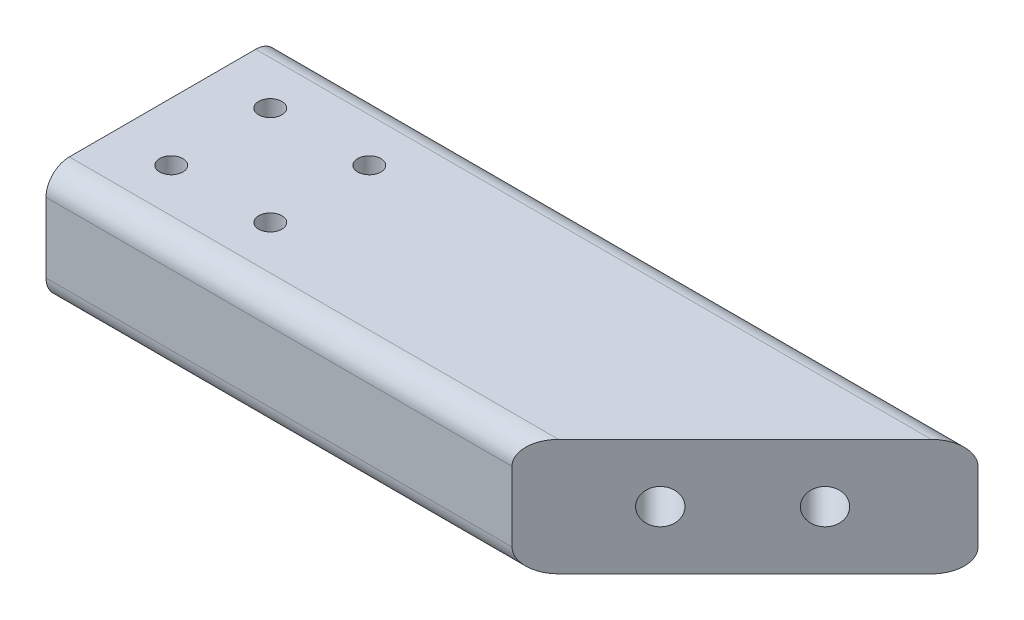
ISO-10303-21;
HEADER;
FILE_DESCRIPTION(('STEP AP214'),'2;1');
FILE_NAME('part.step','',(''),(''),'','','');
FILE_SCHEMA(('AUTOMOTIVE_DESIGN { 1 0 10303 214 1 1 1 1 }'));
ENDSEC;
DATA;
#1=APPLICATION_CONTEXT('core data for automotive mechanical design processes');
#2=APPLICATION_PROTOCOL_DEFINITION('international standard','automotive_design',2000,#1);
#3=PRODUCT_CONTEXT('',#1,'mechanical');
#4=PRODUCT('Part','Part','',(#3));
#5=PRODUCT_RELATED_PRODUCT_CATEGORY('part','',(#4));
#6=PRODUCT_DEFINITION_FORMATION('','',#4);
#7=PRODUCT_DEFINITION_CONTEXT('part definition',#1,'design');
#8=PRODUCT_DEFINITION('design','',#6,#7);
#9=PRODUCT_DEFINITION_SHAPE('','',#8);
#10=(LENGTH_UNIT() NAMED_UNIT(*) SI_UNIT(.MILLI.,.METRE.));
#11=(NAMED_UNIT(*) PLANE_ANGLE_UNIT() SI_UNIT($,.RADIAN.));
#12=(NAMED_UNIT(*) SI_UNIT($,.STERADIAN.) SOLID_ANGLE_UNIT());
#13=UNCERTAINTY_MEASURE_WITH_UNIT(LENGTH_MEASURE(1.E-05),#10,'distance_accuracy_value','');
#14=(GEOMETRIC_REPRESENTATION_CONTEXT(3) GLOBAL_UNCERTAINTY_ASSIGNED_CONTEXT((#13)) GLOBAL_UNIT_ASSIGNED_CONTEXT((#10,
#11,#12)) REPRESENTATION_CONTEXT('',''));
#15=CARTESIAN_POINT('',(0.,0.,0.));
#16=DIRECTION('',(0.,0.,1.));
#17=DIRECTION('',(1.,0.,0.));
#18=AXIS2_PLACEMENT_3D('',#15,#16,#17);
#19=CARTESIAN_POINT('',(30.,10.,-10.));
#20=DIRECTION('',(0.,0.,1.));
#21=DIRECTION('',(1.,0.,0.));
#22=AXIS2_PLACEMENT_3D('',#19,#20,#21);
#23=PLANE('',#22);
#24=DIRECTION('',(0.,-1.,0.));
#25=VECTOR('',#24,1.);
#26=CARTESIAN_POINT('',(30.,10.,-10.));
#27=LINE('',#26,#25);
#28=CARTESIAN_POINT('',(30.,8.,-10.));
#29=VERTEX_POINT('',#28);
#30=CARTESIAN_POINT('',(30.,2.,-10.));
#31=VERTEX_POINT('',#30);
#32=EDGE_CURVE('E140',#29,#31,#27,.T.);
#33=ORIENTED_EDGE('',*,*,#32,.T.);
#34=DIRECTION('',(-1.,0.,0.));
#35=VECTOR('',#34,1.);
#36=CARTESIAN_POINT('',(30.,2.,-10.));
#37=LINE('',#36,#35);
#38=CARTESIAN_POINT('',(19.4195674418851,2.,-9.99999999999999));
#39=VERTEX_POINT('',#38);
#40=EDGE_CURVE('E202',#31,#39,#37,.T.);
#41=ORIENTED_EDGE('',*,*,#40,.T.);
#42=CARTESIAN_POINT('',(16.8700576850887,5.,-9.99999999999999));
#43=DIRECTION('',(0.,0.,1.));
#44=DIRECTION('',(1.,0.,0.));
#45=AXIS2_PLACEMENT_3D('',#42,#43,#44);
#46=ELLIPSE('',#45,4.94974746830583,3.5);
#47=CARTESIAN_POINT('',(19.4195674418851,8.,-10.));
#48=VERTEX_POINT('',#47);
#49=EDGE_CURVE('E348',#39,#48,#46,.T.);
#50=ORIENTED_EDGE('',*,*,#49,.T.);
#51=DIRECTION('',(-1.,0.,0.));
#52=VECTOR('',#51,1.);
#53=CARTESIAN_POINT('',(30.,8.,-10.));
#54=LINE('',#53,#52);
#55=EDGE_CURVE('E195',#48,#29,#54,.F.);
#56=ORIENTED_EDGE('',*,*,#55,.T.);
#57=EDGE_LOOP('',(#33,#41,#50,#56));
#58=FACE_BOUND('',#57,.T.);
#59=ADVANCED_FACE('F39',(#58),#23,.F.);
#60=CARTESIAN_POINT('',(14.3205479282924,8.,-9.99999999999999));
#61=VERTEX_POINT('',#60);
#62=CARTESIAN_POINT('',(14.3205479282924,2.,-10.));
#63=VERTEX_POINT('',#62);
#64=EDGE_CURVE('E347',#61,#63,#46,.T.);
#65=ORIENTED_EDGE('',*,*,#64,.T.);
#66=DIRECTION('',(-1.,0.,0.));
#67=VECTOR('',#66,1.);
#68=CARTESIAN_POINT('',(30.,2.,-10.));
#69=LINE('',#68,#67);
#70=CARTESIAN_POINT('',(5.27743181815422,2.,-10.));
#71=VERTEX_POINT('',#70);
#72=EDGE_CURVE('E199',#63,#71,#69,.T.);
#73=ORIENTED_EDGE('',*,*,#72,.T.);
#74=CARTESIAN_POINT('',(2.72792206135783,5.,-10.));
#75=DIRECTION('',(0.,0.,1.));
#76=DIRECTION('',(1.,0.,0.));
#77=AXIS2_PLACEMENT_3D('',#74,#75,#76);
#78=ELLIPSE('',#77,4.94974746830583,3.5);
#79=CARTESIAN_POINT('',(5.27743181815422,8.,-10.));
#80=VERTEX_POINT('',#79);
#81=EDGE_CURVE('E166',#71,#80,#78,.T.);
#82=ORIENTED_EDGE('',*,*,#81,.T.);
#83=DIRECTION('',(-1.,0.,0.));
#84=VECTOR('',#83,1.);
#85=CARTESIAN_POINT('',(30.,8.,-10.));
#86=LINE('',#85,#84);
#87=EDGE_CURVE('E193',#80,#61,#86,.F.);
#88=ORIENTED_EDGE('',*,*,#87,.T.);
#89=EDGE_LOOP('',(#65,#73,#82,#88));
#90=FACE_BOUND('',#89,.T.);
#91=ADVANCED_FACE('F262',(#90),#23,.F.);
#92=CARTESIAN_POINT('',(-30.,10.,10.));
#93=DIRECTION('',(1.,0.,0.));
#94=DIRECTION('',(0.,0.,-1.));
#95=AXIS2_PLACEMENT_3D('',#92,#93,#94);
#96=PLANE('',#95);
#97=DIRECTION('',(0.,-1.,0.));
#98=VECTOR('',#97,1.);
#99=CARTESIAN_POINT('',(-30.,10.,10.));
#100=LINE('',#99,#98);
#101=CARTESIAN_POINT('',(-30.,8.,10.));
#102=VERTEX_POINT('',#101);
#103=CARTESIAN_POINT('',(-30.,2.,10.));
#104=VERTEX_POINT('',#103);
#105=EDGE_CURVE('E162',#102,#104,#100,.T.);
#106=ORIENTED_EDGE('',*,*,#105,.F.);
#107=CARTESIAN_POINT('',(-30.,8.,8.00000000000001));
#108=DIRECTION('',(1.,0.,0.));
#109=DIRECTION('',(0.,0.,-1.));
#110=AXIS2_PLACEMENT_3D('',#107,#108,#109);
#111=CIRCLE('',#110,2.);
#112=CARTESIAN_POINT('',(-30.,10.,8.00000000000001));
#113=VERTEX_POINT('',#112);
#114=EDGE_CURVE('E187',#102,#113,#111,.F.);
#115=ORIENTED_EDGE('',*,*,#114,.T.);
#116=DIRECTION('',(0.,0.,1.));
#117=VECTOR('',#116,1.);
#118=CARTESIAN_POINT('',(-30.,10.,10.));
#119=LINE('',#118,#117);
#120=CARTESIAN_POINT('',(-30.,10.,-7.99999999999999));
#121=VERTEX_POINT('',#120);
#122=EDGE_CURVE('E337',#121,#113,#119,.T.);
#123=ORIENTED_EDGE('',*,*,#122,.F.);
#124=CARTESIAN_POINT('',(-30.,8.,-7.99999999999999));
#125=DIRECTION('',(1.,0.,0.));
#126=DIRECTION('',(0.,0.,-1.));
#127=AXIS2_PLACEMENT_3D('',#124,#125,#126);
#128=CIRCLE('',#127,2.);
#129=CARTESIAN_POINT('',(-30.,8.,-9.99999999999999));
#130=VERTEX_POINT('',#129);
#131=EDGE_CURVE('E163',#121,#130,#128,.F.);
#132=ORIENTED_EDGE('',*,*,#131,.T.);
#133=DIRECTION('',(0.,-1.,0.));
#134=VECTOR('',#133,1.);
#135=CARTESIAN_POINT('',(-30.,10.,-9.99999999999999));
#136=LINE('',#135,#134);
#137=CARTESIAN_POINT('',(-30.,2.,-9.99999999999999));
#138=VERTEX_POINT('',#137);
#139=EDGE_CURVE('E294',#130,#138,#136,.T.);
#140=ORIENTED_EDGE('',*,*,#139,.T.);
#141=CARTESIAN_POINT('',(-30.,2.,-7.99999999999999));
#142=DIRECTION('',(1.,0.,0.));
#143=DIRECTION('',(0.,0.,-1.));
#144=AXIS2_PLACEMENT_3D('',#141,#142,#143);
#145=CIRCLE('',#144,2.);
#146=CARTESIAN_POINT('',(-30.,0.,-7.99999999999999));
#147=VERTEX_POINT('',#146);
#148=EDGE_CURVE('E185',#138,#147,#145,.F.);
#149=ORIENTED_EDGE('',*,*,#148,.T.);
#150=DIRECTION('',(0.,0.,1.));
#151=VECTOR('',#150,1.);
#152=CARTESIAN_POINT('',(-30.,0.,10.));
#153=LINE('',#152,#151);
#154=CARTESIAN_POINT('',(-30.,0.,8.00000000000001));
#155=VERTEX_POINT('',#154);
#156=EDGE_CURVE('E334',#147,#155,#153,.T.);
#157=ORIENTED_EDGE('',*,*,#156,.T.);
#158=CARTESIAN_POINT('',(-30.,2.,8.00000000000001));
#159=DIRECTION('',(1.,0.,0.));
#160=DIRECTION('',(0.,0.,-1.));
#161=AXIS2_PLACEMENT_3D('',#158,#159,#160);
#162=CIRCLE('',#161,2.);
#163=EDGE_CURVE('E183',#155,#104,#162,.F.);
#164=ORIENTED_EDGE('',*,*,#163,.T.);
#165=EDGE_LOOP('',(#106,#115,#123,#132,#140,#149,#157,#164));
#166=FACE_BOUND('',#165,.T.);
#167=ADVANCED_FACE('F267',(#166),#96,.F.);
#168=CARTESIAN_POINT('',(30.,10.,10.));
#169=DIRECTION('',(0.,0.,-1.));
#170=DIRECTION('',(-1.,0.,0.));
#171=AXIS2_PLACEMENT_3D('',#168,#169,#170);
#172=PLANE('',#171);
#173=DIRECTION('',(0.,1.,0.));
#174=VECTOR('',#173,1.);
#175=CARTESIAN_POINT('',(9.99999999999992,0.,10.));
#176=LINE('',#175,#174);
#177=CARTESIAN_POINT('',(9.99999999999992,2.,10.));
#178=VERTEX_POINT('',#177);
#179=CARTESIAN_POINT('',(9.99999999999992,8.,10.));
#180=VERTEX_POINT('',#179);
#181=EDGE_CURVE('E302',#178,#180,#176,.T.);
#182=ORIENTED_EDGE('',*,*,#181,.T.);
#183=DIRECTION('',(1.,0.,0.));
#184=VECTOR('',#183,1.);
#185=CARTESIAN_POINT('',(-30.,8.,10.));
#186=LINE('',#185,#184);
#187=EDGE_CURVE('E177',#180,#102,#186,.F.);
#188=ORIENTED_EDGE('',*,*,#187,.T.);
#189=ORIENTED_EDGE('',*,*,#105,.T.);
#190=DIRECTION('',(1.,0.,0.));
#191=VECTOR('',#190,1.);
#192=CARTESIAN_POINT('',(30.,2.,10.));
#193=LINE('',#192,#191);
#194=EDGE_CURVE('E176',#104,#178,#193,.T.);
#195=ORIENTED_EDGE('',*,*,#194,.T.);
#196=EDGE_LOOP('',(#182,#188,#189,#195));
#197=FACE_BOUND('',#196,.T.);
#198=ADVANCED_FACE('F265',(#197),#172,.F.);
#199=CARTESIAN_POINT('',(0.178412304561435,8.,-10.));
#200=VERTEX_POINT('',#199);
#201=CARTESIAN_POINT('',(0.178412304561434,2.,-10.));
#202=VERTEX_POINT('',#201);
#203=EDGE_CURVE('E351',#200,#202,#78,.T.);
#204=ORIENTED_EDGE('',*,*,#203,.T.);
#205=DIRECTION('',(-1.,0.,0.));
#206=VECTOR('',#205,1.);
#207=CARTESIAN_POINT('',(30.,2.,-10.));
#208=LINE('',#207,#206);
#209=EDGE_CURVE('E198',#202,#138,#208,.T.);
#210=ORIENTED_EDGE('',*,*,#209,.T.);
#211=ORIENTED_EDGE('',*,*,#139,.F.);
#212=DIRECTION('',(-1.,0.,0.));
#213=VECTOR('',#212,1.);
#214=CARTESIAN_POINT('',(30.,8.,-10.));
#215=LINE('',#214,#213);
#216=EDGE_CURVE('E196',#130,#200,#215,.F.);
#217=ORIENTED_EDGE('',*,*,#216,.T.);
#218=EDGE_LOOP('',(#204,#210,#211,#217));
#219=FACE_BOUND('',#218,.T.);
#220=ADVANCED_FACE('F256',(#219),#23,.F.);
#221=CARTESIAN_POINT('',(0.,10.,0.));
#222=DIRECTION('',(0.,1.,0.));
#223=DIRECTION('',(0.,0.,1.));
#224=AXIS2_PLACEMENT_3D('',#221,#222,#223);
#225=PLANE('',#224);
#226=ORIENTED_EDGE('',*,*,#122,.T.);
#227=DIRECTION('',(1.,0.,0.));
#228=VECTOR('',#227,1.);
#229=CARTESIAN_POINT('',(9.99999999999992,10.,8.));
#230=LINE('',#229,#228);
#231=CARTESIAN_POINT('',(11.9999999999999,10.,8.));
#232=VERTEX_POINT('',#231);
#233=EDGE_CURVE('E143',#113,#232,#230,.T.);
#234=ORIENTED_EDGE('',*,*,#233,.T.);
#235=DIRECTION('',(-0.707106781186549,0.,0.707106781186546));
#236=VECTOR('',#235,1.);
#237=CARTESIAN_POINT('',(9.99999999999992,10.,10.));
#238=LINE('',#237,#236);
#239=CARTESIAN_POINT('',(28.,10.,-8.));
#240=VERTEX_POINT('',#239);
#241=EDGE_CURVE('E139',#240,#232,#238,.T.);
#242=ORIENTED_EDGE('',*,*,#241,.F.);
#243=DIRECTION('',(-1.,0.,0.));
#244=VECTOR('',#243,1.);
#245=CARTESIAN_POINT('',(-30.,10.,-7.99999999999999));
#246=LINE('',#245,#244);
#247=EDGE_CURVE('E153',#240,#121,#246,.T.);
#248=ORIENTED_EDGE('',*,*,#247,.T.);
#249=EDGE_LOOP('',(#226,#234,#242,#248));
#250=FACE_BOUND('',#249,.T.);
#251=CARTESIAN_POINT('',(-25.,10.,4.25));
#252=DIRECTION('',(0.,1.,0.));
#253=DIRECTION('',(0.,0.,1.));
#254=AXIS2_PLACEMENT_3D('',#251,#252,#253);
#255=CIRCLE('',#254,0.999999999999998);
#256=CARTESIAN_POINT('',(-25.,10.,5.25));
#257=VERTEX_POINT('',#256);
#258=EDGE_CURVE('E324',#257,#257,#255,.T.);
#259=ORIENTED_EDGE('',*,*,#258,.F.);
#260=EDGE_LOOP('',(#259));
#261=FACE_BOUND('',#260,.T.);
#262=CARTESIAN_POINT('',(-16.5,10.,4.25000000000001));
#263=DIRECTION('',(0.,1.,0.));
#264=DIRECTION('',(0.,0.,1.));
#265=AXIS2_PLACEMENT_3D('',#262,#263,#264);
#266=CIRCLE('',#265,0.999999999999998);
#267=CARTESIAN_POINT('',(-16.5,10.,5.25000000000001));
#268=VERTEX_POINT('',#267);
#269=EDGE_CURVE('E316',#268,#268,#266,.T.);
#270=ORIENTED_EDGE('',*,*,#269,.F.);
#271=EDGE_LOOP('',(#270));
#272=FACE_BOUND('',#271,.T.);
#273=CARTESIAN_POINT('',(-16.5,10.,-4.24999999999999));
#274=DIRECTION('',(0.,1.,0.));
#275=DIRECTION('',(0.,0.,1.));
#276=AXIS2_PLACEMENT_3D('',#273,#274,#275);
#277=CIRCLE('',#276,0.999999999999998);
#278=CARTESIAN_POINT('',(-16.5,10.,-3.24999999999999));
#279=VERTEX_POINT('',#278);
#280=EDGE_CURVE('E315',#279,#279,#277,.T.);
#281=ORIENTED_EDGE('',*,*,#280,.F.);
#282=EDGE_LOOP('',(#281));
#283=FACE_BOUND('',#282,.T.);
#284=CARTESIAN_POINT('',(-25.,10.,-4.25));
#285=DIRECTION('',(0.,1.,0.));
#286=DIRECTION('',(0.,0.,1.));
#287=AXIS2_PLACEMENT_3D('',#284,#285,#286);
#288=CIRCLE('',#287,0.999999999999998);
#289=CARTESIAN_POINT('',(-25.,10.,-3.25));
#290=VERTEX_POINT('',#289);
#291=EDGE_CURVE('E314',#290,#290,#288,.T.);
#292=ORIENTED_EDGE('',*,*,#291,.F.);
#293=EDGE_LOOP('',(#292));
#294=FACE_BOUND('',#293,.T.);
#295=ADVANCED_FACE('F151',(#250,#261,#272,#283,#294),#225,.T.);
#296=CARTESIAN_POINT('',(0.,0.,0.));
#297=DIRECTION('',(0.,1.,0.));
#298=DIRECTION('',(0.,0.,1.));
#299=AXIS2_PLACEMENT_3D('',#296,#297,#298);
#300=PLANE('',#299);
#301=CARTESIAN_POINT('',(-25.,0.,4.25));
#302=DIRECTION('',(0.,1.,0.));
#303=DIRECTION('',(0.,0.,1.));
#304=AXIS2_PLACEMENT_3D('',#301,#302,#303);
#305=CIRCLE('',#304,0.999999999999998);
#306=CARTESIAN_POINT('',(-25.,0.,5.25));
#307=VERTEX_POINT('',#306);
#308=EDGE_CURVE('E310',#307,#307,#305,.T.);
#309=ORIENTED_EDGE('',*,*,#308,.T.);
#310=EDGE_LOOP('',(#309));
#311=FACE_BOUND('',#310,.T.);
#312=CARTESIAN_POINT('',(-16.5,0.,4.25000000000001));
#313=DIRECTION('',(0.,1.,0.));
#314=DIRECTION('',(0.,0.,1.));
#315=AXIS2_PLACEMENT_3D('',#312,#313,#314);
#316=CIRCLE('',#315,0.999999999999998);
#317=CARTESIAN_POINT('',(-16.5,0.,5.25000000000001));
#318=VERTEX_POINT('',#317);
#319=EDGE_CURVE('E325',#318,#318,#316,.T.);
#320=ORIENTED_EDGE('',*,*,#319,.T.);
#321=EDGE_LOOP('',(#320));
#322=FACE_BOUND('',#321,.T.);
#323=CARTESIAN_POINT('',(-16.5,0.,-4.24999999999999));
#324=DIRECTION('',(0.,1.,0.));
#325=DIRECTION('',(0.,0.,1.));
#326=AXIS2_PLACEMENT_3D('',#323,#324,#325);
#327=CIRCLE('',#326,0.999999999999998);
#328=CARTESIAN_POINT('',(-16.5,0.,-3.24999999999999));
#329=VERTEX_POINT('',#328);
#330=EDGE_CURVE('E317',#329,#329,#327,.T.);
#331=ORIENTED_EDGE('',*,*,#330,.T.);
#332=EDGE_LOOP('',(#331));
#333=FACE_BOUND('',#332,.T.);
#334=CARTESIAN_POINT('',(-25.,0.,-4.25));
#335=DIRECTION('',(0.,1.,0.));
#336=DIRECTION('',(0.,0.,1.));
#337=AXIS2_PLACEMENT_3D('',#334,#335,#336);
#338=CIRCLE('',#337,0.999999999999998);
#339=CARTESIAN_POINT('',(-25.,0.,-3.25));
#340=VERTEX_POINT('',#339);
#341=EDGE_CURVE('E329',#340,#340,#338,.T.);
#342=ORIENTED_EDGE('',*,*,#341,.T.);
#343=EDGE_LOOP('',(#342));
#344=FACE_BOUND('',#343,.T.);
#345=DIRECTION('',(-0.707106781186549,0.,0.707106781186546));
#346=VECTOR('',#345,1.);
#347=CARTESIAN_POINT('',(9.99999999999992,0.,10.));
#348=LINE('',#347,#346);
#349=CARTESIAN_POINT('',(28.,0.,-8.));
#350=VERTEX_POINT('',#349);
#351=CARTESIAN_POINT('',(11.9999999999999,0.,8.));
#352=VERTEX_POINT('',#351);
#353=EDGE_CURVE('E156',#350,#352,#348,.T.);
#354=ORIENTED_EDGE('',*,*,#353,.T.);
#355=DIRECTION('',(1.,0.,0.));
#356=VECTOR('',#355,1.);
#357=CARTESIAN_POINT('',(0.,0.,8.));
#358=LINE('',#357,#356);
#359=EDGE_CURVE('E188',#352,#155,#358,.F.);
#360=ORIENTED_EDGE('',*,*,#359,.T.);
#361=ORIENTED_EDGE('',*,*,#156,.F.);
#362=DIRECTION('',(-1.,0.,0.));
#363=VECTOR('',#362,1.);
#364=CARTESIAN_POINT('',(0.,0.,-8.));
#365=LINE('',#364,#363);
#366=EDGE_CURVE('E189',#147,#350,#365,.F.);
#367=ORIENTED_EDGE('',*,*,#366,.T.);
#368=EDGE_LOOP('',(#354,#360,#361,#367));
#369=FACE_BOUND('',#368,.T.);
#370=ADVANCED_FACE('F255',(#311,#322,#333,#344,#369),#300,.F.);
#371=CARTESIAN_POINT('',(-25.,0.,-4.25));
#372=DIRECTION('',(0.,1.,0.));
#373=DIRECTION('',(0.,0.,1.));
#374=AXIS2_PLACEMENT_3D('',#371,#372,#373);
#375=CYLINDRICAL_SURFACE('',#374,0.999999999999998);
#376=ORIENTED_EDGE('',*,*,#341,.F.);
#377=EDGE_LOOP('',(#376));
#378=FACE_BOUND('',#377,.T.);
#379=ORIENTED_EDGE('',*,*,#291,.T.);
#380=EDGE_LOOP('',(#379));
#381=FACE_BOUND('',#380,.T.);
#382=ADVANCED_FACE('F245',(#378,#381),#375,.F.);
#383=CARTESIAN_POINT('',(-16.5,0.,-4.24999999999999));
#384=DIRECTION('',(0.,1.,0.));
#385=DIRECTION('',(0.,0.,1.));
#386=AXIS2_PLACEMENT_3D('',#383,#384,#385);
#387=CYLINDRICAL_SURFACE('',#386,0.999999999999998);
#388=ORIENTED_EDGE('',*,*,#330,.F.);
#389=EDGE_LOOP('',(#388));
#390=FACE_BOUND('',#389,.T.);
#391=ORIENTED_EDGE('',*,*,#280,.T.);
#392=EDGE_LOOP('',(#391));
#393=FACE_BOUND('',#392,.T.);
#394=ADVANCED_FACE('F238',(#390,#393),#387,.F.);
#395=CARTESIAN_POINT('',(-16.5,0.,4.25000000000001));
#396=DIRECTION('',(0.,1.,0.));
#397=DIRECTION('',(0.,0.,1.));
#398=AXIS2_PLACEMENT_3D('',#395,#396,#397);
#399=CYLINDRICAL_SURFACE('',#398,0.999999999999998);
#400=ORIENTED_EDGE('',*,*,#319,.F.);
#401=EDGE_LOOP('',(#400));
#402=FACE_BOUND('',#401,.T.);
#403=ORIENTED_EDGE('',*,*,#269,.T.);
#404=EDGE_LOOP('',(#403));
#405=FACE_BOUND('',#404,.T.);
#406=ADVANCED_FACE('F241',(#402,#405),#399,.F.);
#407=CARTESIAN_POINT('',(-25.,0.,4.25));
#408=DIRECTION('',(0.,1.,0.));
#409=DIRECTION('',(0.,0.,1.));
#410=AXIS2_PLACEMENT_3D('',#407,#408,#409);
#411=CYLINDRICAL_SURFACE('',#410,0.999999999999998);
#412=ORIENTED_EDGE('',*,*,#308,.F.);
#413=EDGE_LOOP('',(#412));
#414=FACE_BOUND('',#413,.T.);
#415=ORIENTED_EDGE('',*,*,#258,.T.);
#416=EDGE_LOOP('',(#415));
#417=FACE_BOUND('',#416,.T.);
#418=ADVANCED_FACE('F236',(#414,#417),#411,.F.);
#419=CARTESIAN_POINT('',(9.99999999999992,0.,10.));
#420=DIRECTION('',(-0.707106781186546,0.,-0.707106781186549));
#421=DIRECTION('',(-0.707106781186549,0.,0.707106781186546));
#422=AXIS2_PLACEMENT_3D('',#419,#420,#421);
#423=PLANE('',#422);
#424=CARTESIAN_POINT('',(16.3639610306789,5.,3.63603896932108));
#425=DIRECTION('',(0.707106781186546,0.,0.707106781186549));
#426=DIRECTION('',(0.707106781186549,0.,-0.707106781186546));
#427=AXIS2_PLACEMENT_3D('',#424,#425,#426);
#428=CIRCLE('',#427,1.5);
#429=CARTESIAN_POINT('',(17.4246212024587,5.,2.57537879754126));
#430=VERTEX_POINT('',#429);
#431=EDGE_CURVE('E355',#430,#430,#428,.T.);
#432=ORIENTED_EDGE('',*,*,#431,.F.);
#433=EDGE_LOOP('',(#432));
#434=FACE_BOUND('',#433,.T.);
#435=CARTESIAN_POINT('',(23.4350288425444,5.,-3.43502884254438));
#436=DIRECTION('',(0.707106781186546,0.,0.707106781186549));
#437=DIRECTION('',(0.707106781186549,0.,-0.707106781186546));
#438=AXIS2_PLACEMENT_3D('',#435,#436,#437);
#439=CIRCLE('',#438,1.5);
#440=CARTESIAN_POINT('',(24.4956890143242,5.,-4.49568901432421));
#441=VERTEX_POINT('',#440);
#442=EDGE_CURVE('E157',#441,#441,#439,.T.);
#443=ORIENTED_EDGE('',*,*,#442,.F.);
#444=EDGE_LOOP('',(#443));
#445=FACE_BOUND('',#444,.T.);
#446=ORIENTED_EDGE('',*,*,#241,.T.);
#447=CARTESIAN_POINT('',(11.9999999999999,8.,8.));
#448=DIRECTION('',(-0.707106781186546,0.,-0.707106781186549));
#449=DIRECTION('',(-0.707106781186549,0.,0.707106781186546));
#450=AXIS2_PLACEMENT_3D('',#447,#448,#449);
#451=ELLIPSE('',#450,2.82842712474619,2.);
#452=EDGE_CURVE('E172',#232,#180,#451,.F.);
#453=ORIENTED_EDGE('',*,*,#452,.T.);
#454=ORIENTED_EDGE('',*,*,#181,.F.);
#455=CARTESIAN_POINT('',(11.9999999999999,2.,8.));
#456=DIRECTION('',(-0.707106781186546,0.,-0.707106781186549));
#457=DIRECTION('',(0.707106781186549,0.,-0.707106781186546));
#458=AXIS2_PLACEMENT_3D('',#455,#456,#457);
#459=ELLIPSE('',#458,2.82842712474619,2.);
#460=EDGE_CURVE('E175',#178,#352,#459,.F.);
#461=ORIENTED_EDGE('',*,*,#460,.T.);
#462=ORIENTED_EDGE('',*,*,#353,.F.);
#463=CARTESIAN_POINT('',(28.,2.,-8.));
#464=DIRECTION('',(-0.707106781186546,0.,-0.707106781186549));
#465=DIRECTION('',(-0.707106781186549,0.,0.707106781186546));
#466=AXIS2_PLACEMENT_3D('',#463,#464,#465);
#467=ELLIPSE('',#466,2.82842712474619,2.);
#468=EDGE_CURVE('E144',#350,#31,#467,.F.);
#469=ORIENTED_EDGE('',*,*,#468,.T.);
#470=ORIENTED_EDGE('',*,*,#32,.F.);
#471=CARTESIAN_POINT('',(28.,8.,-8.));
#472=DIRECTION('',(-0.707106781186546,0.,-0.707106781186549));
#473=DIRECTION('',(0.707106781186549,0.,-0.707106781186546));
#474=AXIS2_PLACEMENT_3D('',#471,#472,#473);
#475=ELLIPSE('',#474,2.82842712474619,2.);
#476=EDGE_CURVE('E134',#29,#240,#475,.F.);
#477=ORIENTED_EDGE('',*,*,#476,.T.);
#478=EDGE_LOOP('',(#446,#453,#454,#461,#462,#469,#470,#477));
#479=FACE_BOUND('',#478,.T.);
#480=ADVANCED_FACE('F137',(#434,#445,#479),#423,.F.);
#481=CARTESIAN_POINT('',(-6.56497115745554,5.,-33.4350288425444));
#482=DIRECTION('',(0.707106781186546,0.,0.707106781186549));
#483=DIRECTION('',(0.707106781186549,0.,-0.707106781186546));
#484=AXIS2_PLACEMENT_3D('',#481,#482,#483);
#485=CYLINDRICAL_SURFACE('',#484,1.5);
#486=CARTESIAN_POINT('',(19.8994949366116,5.,-6.97056274847713));
#487=DIRECTION('',(0.707106781186546,0.,0.707106781186549));
#488=DIRECTION('',(0.707106781186549,0.,-0.707106781186546));
#489=AXIS2_PLACEMENT_3D('',#486,#487,#488);
#490=CIRCLE('',#489,1.5);
#491=CARTESIAN_POINT('',(20.9601551083914,5.,-8.03122292025695));
#492=VERTEX_POINT('',#491);
#493=EDGE_CURVE('E344',#492,#492,#490,.F.);
#494=ORIENTED_EDGE('',*,*,#493,.T.);
#495=EDGE_LOOP('',(#494));
#496=FACE_BOUND('',#495,.T.);
#497=ORIENTED_EDGE('',*,*,#442,.T.);
#498=EDGE_LOOP('',(#497));
#499=FACE_BOUND('',#498,.T.);
#500=ADVANCED_FACE('F230',(#496,#499),#485,.F.);
#501=CARTESIAN_POINT('',(-13.636038969321,5.,-26.3639610306789));
#502=DIRECTION('',(0.707106781186546,0.,0.707106781186549));
#503=DIRECTION('',(0.707106781186549,0.,-0.707106781186546));
#504=AXIS2_PLACEMENT_3D('',#501,#502,#503);
#505=CYLINDRICAL_SURFACE('',#504,1.5);
#506=CARTESIAN_POINT('',(12.8284271247461,5.,0.100505063388337));
#507=DIRECTION('',(0.707106781186546,0.,0.707106781186549));
#508=DIRECTION('',(0.707106781186549,0.,-0.707106781186546));
#509=AXIS2_PLACEMENT_3D('',#506,#507,#508);
#510=CIRCLE('',#509,1.5);
#511=CARTESIAN_POINT('',(13.8890872965259,5.,-0.960155108391484));
#512=VERTEX_POINT('',#511);
#513=EDGE_CURVE('E345',#512,#512,#510,.F.);
#514=ORIENTED_EDGE('',*,*,#513,.T.);
#515=EDGE_LOOP('',(#514));
#516=FACE_BOUND('',#515,.T.);
#517=ORIENTED_EDGE('',*,*,#431,.T.);
#518=EDGE_LOOP('',(#517));
#519=FACE_BOUND('',#518,.T.);
#520=ADVANCED_FACE('F223',(#516,#519),#505,.F.);
#521=CARTESIAN_POINT('',(-13.636038969321,5.,-26.3639610306789));
#522=DIRECTION('',(0.707106781186546,0.,0.707106781186549));
#523=DIRECTION('',(0.707106781186549,0.,-0.707106781186546));
#524=AXIS2_PLACEMENT_3D('',#521,#522,#523);
#525=CYLINDRICAL_SURFACE('',#524,3.5);
#526=CARTESIAN_POINT('',(12.8284271247461,5.,0.10050506338834));
#527=DIRECTION('',(0.707106781186546,0.,0.707106781186549));
#528=DIRECTION('',(0.707106781186549,0.,-0.707106781186546));
#529=AXIS2_PLACEMENT_3D('',#526,#527,#528);
#530=CIRCLE('',#529,3.5);
#531=CARTESIAN_POINT('',(15.3033008588991,5.,-2.37436867076457));
#532=VERTEX_POINT('',#531);
#533=EDGE_CURVE('E362',#532,#532,#530,.T.);
#534=ORIENTED_EDGE('',*,*,#533,.T.);
#535=EDGE_LOOP('',(#534));
#536=FACE_BOUND('',#535,.T.);
#537=ORIENTED_EDGE('',*,*,#81,.F.);
#538=CARTESIAN_POINT('',(5.27743181815422,2.,-10.));
#539=CARTESIAN_POINT('',(5.1991996358424,1.96674496837221,-9.99999751404754));
#540=CARTESIAN_POINT('',(5.12033684037217,1.93497776875181,-9.99917064895409));
#541=CARTESIAN_POINT('',(4.96143659659128,1.87459748487571,-9.99629408194677));
#542=CARTESIAN_POINT('',(4.88139917238268,1.84598433600469,-9.99424440508951));
#543=CARTESIAN_POINT('',(4.72027076561615,1.79210184610488,-9.98934924738383));
#544=CARTESIAN_POINT('',(4.63918029394908,1.76683094557257,-9.98650413962947));
#545=CARTESIAN_POINT('',(4.47603138306404,1.71971687881384,-9.98040484185301));
#546=CARTESIAN_POINT('',(4.39397295242425,1.69787368223515,-9.97715065545377));
#547=CARTESIAN_POINT('',(4.14693896255529,1.63767342061769,-9.96733059917311));
#548=CARTESIAN_POINT('',(3.9806711983518,1.60450045388755,-9.96069016648953));
#549=CARTESIAN_POINT('',(3.64595307993015,1.55188047978852,-9.94933628751588));
#550=CARTESIAN_POINT('',(3.47750279577971,1.53243303288128,-9.94462277952109));
#551=CARTESIAN_POINT('',(3.13535843017035,1.50628647655802,-9.938151994291));
#552=CARTESIAN_POINT('',(2.96163802259642,1.49991599886421,-9.93647104967939));
#553=CARTESIAN_POINT('',(2.61418386807901,1.50008576987903,-9.93651275295947));
#554=CARTESIAN_POINT('',(2.44045012793617,1.50662911675484,-9.93823621760611));
#555=CARTESIAN_POINT('',(2.09397644573106,1.53200685792437,-9.94451785803927));
#556=CARTESIAN_POINT('',(1.92123637115699,1.55083957312875,-9.94907564656974));
#557=CARTESIAN_POINT('',(1.57758945716104,1.60060405501952,-9.95988228279801));
#558=CARTESIAN_POINT('',(1.40668212382814,1.63153247329043,-9.96613066234743));
#559=CARTESIAN_POINT('',(1.14667064802079,1.68861021776911,-9.97571113920668));
#560=CARTESIAN_POINT('',(1.05656342486153,1.71026917552631,-9.97904521385322));
#561=CARTESIAN_POINT('',(0.877350795912801,1.75734722228527,-9.98536744208652));
#562=CARTESIAN_POINT('',(0.788245051688748,1.78276499726593,-9.98835571591147));
#563=CARTESIAN_POINT('',(0.611435378254331,1.83755255890152,-9.99358366140832));
#564=CARTESIAN_POINT('',(0.523728826806763,1.86691365044692,-9.99582494339473));
#565=CARTESIAN_POINT('',(0.34982648241838,1.9300489192914,-9.99901870264907));
#566=CARTESIAN_POINT('',(0.263631867653322,1.96382637863958,-9.99997021537979));
#567=CARTESIAN_POINT('',(0.178412304561423,1.99999999999993,-10.0000000000001));
#568=B_SPLINE_CURVE_WITH_KNOTS('',3,(#538,#539,#540,#541,#542,#543,#544,#545,#546,#547,#548,
#549,#550,#551,#552,#553,#554,#555,#556,#557,#558,#559,#560,#561,#562,#563,#564,#565,#566,#567),
.UNSPECIFIED.,.F.,.F.,(4,2,2,2,2,2,2,2,2,2,2,2,2,2,4),(0.,0.25499914981973,0.509993074638563,
0.764867595541682,1.01973985940745,1.52811626009085,2.03647638007481,2.55746281048525,
3.07857424640956,3.59961449808137,4.12051061379905,4.39864458135134,4.67668154666016,
4.9541152022495,5.23175621874474),.UNSPECIFIED.);
#569=EDGE_CURVE('E11',#71,#202,#568,.T.);
#570=ORIENTED_EDGE('',*,*,#569,.T.);
#571=ORIENTED_EDGE('',*,*,#203,.F.);
#572=CARTESIAN_POINT('',(0.178412304561434,8.,-10.));
#573=CARTESIAN_POINT('',(0.252764008010591,8.03157065624194,-9.99998186071789));
#574=CARTESIAN_POINT('',(0.3278675842802,8.06130867594062,-9.99925246787362));
#575=CARTESIAN_POINT('',(0.479281508326676,8.11738416527114,-9.9967541451769));
#576=CARTESIAN_POINT('',(0.555591292634114,8.14372317292781,-9.99498568751852));
#577=CARTESIAN_POINT('',(0.709096268748673,8.19326371106255,-9.99079401716236));
#578=CARTESIAN_POINT('',(0.786290284934288,8.21646897792284,-9.98837159471893));
#579=CARTESIAN_POINT('',(0.941489522604263,8.25996567480112,-9.98315330457888));
#580=CARTESIAN_POINT('',(1.01949486521298,8.28025666284566,-9.98035738036159));
#581=CARTESIAN_POINT('',(1.25517883084013,8.33713560349589,-9.9717574551646));
#582=CARTESIAN_POINT('',(1.41388035767294,8.36952464729798,-9.9657631448609));
#583=CARTESIAN_POINT('',(1.73316609292472,8.42371851436724,-9.95479361122695));
#584=CARTESIAN_POINT('',(1.89375117446204,8.44551821294927,-9.94981888199207));
#585=CARTESIAN_POINT('',(2.23411444368273,8.48039144732071,-9.94154291951456));
#586=CARTESIAN_POINT('',(2.41402956611923,8.49221556624408,-9.93849124043887));
#587=CARTESIAN_POINT('',(2.77425966939385,8.50226201250246,-9.93591379062766));
#588=CARTESIAN_POINT('',(2.95457459687809,8.50048605699993,-9.93638757476252));
#589=CARTESIAN_POINT('',(3.31399117983891,8.48248664009583,-9.94095232015758));
#590=CARTESIAN_POINT('',(3.4930947604192,8.46630021785334,-9.94503400784727));
#591=CARTESIAN_POINT('',(3.8491563777478,8.41866971427013,-9.95584130633654));
#592=CARTESIAN_POINT('',(4.02611518183075,8.38723126533011,-9.96256594095183));
#593=CARTESIAN_POINT('',(4.29332684434325,8.3273818801533,-9.97313095264955));
#594=CARTESIAN_POINT('',(4.38488247029643,8.30461173560182,-9.97682599090245));
#595=CARTESIAN_POINT('',(4.56682977868444,8.2548177026894,-9.98386065469292));
#596=CARTESIAN_POINT('',(4.65722170280708,8.22779471353333,-9.98720035511211));
#597=CARTESIAN_POINT('',(4.83675705979852,8.16958314628894,-9.99301205579005));
#598=CARTESIAN_POINT('',(4.92589948475918,8.13839139759917,-9.99548339035863));
#599=CARTESIAN_POINT('',(5.10276587206231,8.07208173953603,-9.99897540359128));
#600=CARTESIAN_POINT('',(5.19048947645016,8.03696285653973,-9.99999572165256));
#601=CARTESIAN_POINT('',(5.27743181815421,7.99999999999998,-10.));
#602=B_SPLINE_CURVE_WITH_KNOTS('',3,(#572,#573,#574,#575,#576,#577,#578,#579,#580,#581,#582,
#583,#584,#585,#586,#587,#588,#589,#590,#591,#592,#593,#594,#595,#596,#597,#598,#599,#600,#601),
.UNSPECIFIED.,.F.,.F.,(4,2,2,2,2,2,2,2,2,2,2,2,2,2,4),(0.,0.242267798854955,0.484425586255407,
0.726292048759262,0.968195153580417,1.45402803972627,1.94009580972683,2.48055427472014,
3.0209445018746,3.55994976362807,4.09875612818496,4.38191953902276,4.66502315913107,
4.94834333569126,5.23173390993709),.UNSPECIFIED.);
#603=EDGE_CURVE('E52',#200,#80,#602,.T.);
#604=ORIENTED_EDGE('',*,*,#603,.T.);
#605=EDGE_LOOP('',(#537,#570,#571,#604));
#606=FACE_BOUND('',#605,.T.);
#607=ADVANCED_FACE('F226',(#536,#606),#525,.F.);
#608=CARTESIAN_POINT('',(12.8284271247461,5.,0.10050506338834));
#609=DIRECTION('',(0.707106781186546,0.,0.707106781186549));
#610=DIRECTION('',(0.707106781186549,0.,-0.707106781186546));
#611=AXIS2_PLACEMENT_3D('',#608,#609,#610);
#612=PLANE('',#611);
#613=ORIENTED_EDGE('',*,*,#533,.F.);
#614=EDGE_LOOP('',(#613));
#615=FACE_BOUND('',#614,.T.);
#616=ORIENTED_EDGE('',*,*,#513,.F.);
#617=EDGE_LOOP('',(#616));
#618=FACE_BOUND('',#617,.T.);
#619=ADVANCED_FACE('F221',(#615,#618),#612,.F.);
#620=CARTESIAN_POINT('',(-6.56497115745555,5.,-33.4350288425444));
#621=DIRECTION('',(0.707106781186546,0.,0.707106781186549));
#622=DIRECTION('',(0.707106781186549,0.,-0.707106781186546));
#623=AXIS2_PLACEMENT_3D('',#620,#621,#622);
#624=CYLINDRICAL_SURFACE('',#623,3.5);
#625=CARTESIAN_POINT('',(19.8994949366116,5.,-6.97056274847712));
#626=DIRECTION('',(0.707106781186546,0.,0.707106781186549));
#627=DIRECTION('',(0.707106781186549,0.,-0.707106781186546));
#628=AXIS2_PLACEMENT_3D('',#625,#626,#627);
#629=CIRCLE('',#628,3.5);
#630=CARTESIAN_POINT('',(22.3743686707645,5.,-9.44543648263004));
#631=VERTEX_POINT('',#630);
#632=EDGE_CURVE('E346',#631,#631,#629,.T.);
#633=ORIENTED_EDGE('',*,*,#632,.T.);
#634=EDGE_LOOP('',(#633));
#635=FACE_BOUND('',#634,.T.);
#636=ORIENTED_EDGE('',*,*,#49,.F.);
#637=CARTESIAN_POINT('',(19.4195674418851,2.,-10.));
#638=CARTESIAN_POINT('',(19.3413352595733,1.96674496837222,-9.99999751404755));
#639=CARTESIAN_POINT('',(19.2624724641031,1.93497776875181,-9.99917064895409));
#640=CARTESIAN_POINT('',(19.1035722203222,1.87459748487571,-9.99629408194677));
#641=CARTESIAN_POINT('',(19.0235347961136,1.84598433600469,-9.99424440508951));
#642=CARTESIAN_POINT('',(18.8624063893471,1.79210184610488,-9.98934924738384));
#643=CARTESIAN_POINT('',(18.78131591768,1.76683094557257,-9.98650413962947));
#644=CARTESIAN_POINT('',(18.618167006795,1.71971687881384,-9.98040484185302));
#645=CARTESIAN_POINT('',(18.5361085761552,1.69787368223515,-9.97715065545377));
#646=CARTESIAN_POINT('',(18.2890745862862,1.63767342061769,-9.96733059917312));
#647=CARTESIAN_POINT('',(18.1228068220827,1.60450045388755,-9.96069016648953));
#648=CARTESIAN_POINT('',(17.7880887036611,1.55188047978852,-9.94933628751588));
#649=CARTESIAN_POINT('',(17.6196384195106,1.53243303288128,-9.94462277952109));
#650=CARTESIAN_POINT('',(17.2774940539013,1.50628647655802,-9.938151994291));
#651=CARTESIAN_POINT('',(17.1037736463273,1.49991599886421,-9.93647104967939));
#652=CARTESIAN_POINT('',(16.7563194918099,1.50008576987903,-9.93651275295947));
#653=CARTESIAN_POINT('',(16.5825857516671,1.50662911675484,-9.93823621760612));
#654=CARTESIAN_POINT('',(16.236112069462,1.53200685792437,-9.94451785803927));
#655=CARTESIAN_POINT('',(16.0633719948879,1.55083957312876,-9.94907564656974));
#656=CARTESIAN_POINT('',(15.719725080892,1.60060405501952,-9.95988228279802));
#657=CARTESIAN_POINT('',(15.5488177475591,1.63153247329043,-9.96613066234744));
#658=CARTESIAN_POINT('',(15.2888062717517,1.68861021776911,-9.97571113920668));
#659=CARTESIAN_POINT('',(15.1986990485925,1.71026917552631,-9.97904521385323));
#660=CARTESIAN_POINT('',(15.0194864196437,1.75734722228527,-9.98536744208652));
#661=CARTESIAN_POINT('',(14.9303806754197,1.78276499726593,-9.98835571591147));
#662=CARTESIAN_POINT('',(14.7535710019853,1.83755255890152,-9.99358366140832));
#663=CARTESIAN_POINT('',(14.6658644505377,1.86691365044692,-9.99582494339473));
#664=CARTESIAN_POINT('',(14.4919621061493,1.9300489192914,-9.99901870264907));
#665=CARTESIAN_POINT('',(14.4057674913842,1.96382637863958,-9.99997021537979));
#666=CARTESIAN_POINT('',(14.3205479282924,1.99999999999994,-10.0000000000001));
#667=B_SPLINE_CURVE_WITH_KNOTS('',3,(#637,#638,#639,#640,#641,#642,#643,#644,#645,#646,#647,
#648,#649,#650,#651,#652,#653,#654,#655,#656,#657,#658,#659,#660,#661,#662,#663,#664,#665,#666),
.UNSPECIFIED.,.F.,.F.,(4,2,2,2,2,2,2,2,2,2,2,2,2,2,4),(0.,0.254999149819732,0.509993074638562,
0.764867595541687,1.01973985940745,1.52811626009085,2.03647638007481,2.55746281048525,
3.07857424640956,3.59961449808137,4.12051061379905,4.39864458135133,4.67668154666016,
4.95411520224949,5.23175621874473),.UNSPECIFIED.);
#668=EDGE_CURVE('E58',#39,#63,#667,.T.);
#669=ORIENTED_EDGE('',*,*,#668,.T.);
#670=ORIENTED_EDGE('',*,*,#64,.F.);
#671=CARTESIAN_POINT('',(14.3205479282924,8.,-10.));
#672=CARTESIAN_POINT('',(14.3948996317415,8.03157065624194,-9.9999818607179));
#673=CARTESIAN_POINT('',(14.4700032080111,8.06130867594062,-9.99925246787362));
#674=CARTESIAN_POINT('',(14.6214171320576,8.11738416527114,-9.99675414517691));
#675=CARTESIAN_POINT('',(14.697726916365,8.14372317292782,-9.99498568751852));
#676=CARTESIAN_POINT('',(14.8512318924796,8.19326371106255,-9.99079401716236));
#677=CARTESIAN_POINT('',(14.9284259086652,8.21646897792284,-9.98837159471894));
#678=CARTESIAN_POINT('',(15.0836251463352,8.25996567480112,-9.98315330457888));
#679=CARTESIAN_POINT('',(15.1616304889439,8.28025666284566,-9.98035738036159));
#680=CARTESIAN_POINT('',(15.397314454571,8.33713560349589,-9.9717574551646));
#681=CARTESIAN_POINT('',(15.5560159814039,8.36952464729798,-9.96576314486091));
#682=CARTESIAN_POINT('',(15.8753017166556,8.42371851436724,-9.95479361122696));
#683=CARTESIAN_POINT('',(16.035886798193,8.44551821294927,-9.94981888199207));
#684=CARTESIAN_POINT('',(16.3762500674137,8.48039144732071,-9.94154291951456));
#685=CARTESIAN_POINT('',(16.5561651898501,8.49221556624408,-9.93849124043887));
#686=CARTESIAN_POINT('',(16.9163952931248,8.50226201250246,-9.93591379062766));
#687=CARTESIAN_POINT('',(17.096710220609,8.50048605699994,-9.93638757476252));
#688=CARTESIAN_POINT('',(17.4561268035698,8.48248664009583,-9.94095232015758));
#689=CARTESIAN_POINT('',(17.6352303841501,8.46630021785335,-9.94503400784727));
#690=CARTESIAN_POINT('',(17.9912920014787,8.41866971427014,-9.95584130633654));
#691=CARTESIAN_POINT('',(18.1682508055617,8.38723126533012,-9.96256594095183));
#692=CARTESIAN_POINT('',(18.4354624680742,8.32738188015331,-9.97313095264955));
#693=CARTESIAN_POINT('',(18.5270180940273,8.30461173560182,-9.97682599090245));
#694=CARTESIAN_POINT('',(18.7089654024154,8.2548177026894,-9.98386065469292));
#695=CARTESIAN_POINT('',(18.799357326538,8.22779471353333,-9.98720035511211));
#696=CARTESIAN_POINT('',(18.9788926835294,8.16958314628894,-9.99301205579005));
#697=CARTESIAN_POINT('',(19.0680351084901,8.13839139759917,-9.99548339035863));
#698=CARTESIAN_POINT('',(19.2449014957932,8.07208173953603,-9.99897540359128));
#699=CARTESIAN_POINT('',(19.3326251001811,8.03696285653973,-9.99999572165256));
#700=CARTESIAN_POINT('',(19.4195674418851,7.99999999999998,-10.));
#701=B_SPLINE_CURVE_WITH_KNOTS('',3,(#671,#672,#673,#674,#675,#676,#677,#678,#679,#680,#681,
#682,#683,#684,#685,#686,#687,#688,#689,#690,#691,#692,#693,#694,#695,#696,#697,#698,#699,#700),
.UNSPECIFIED.,.F.,.F.,(4,2,2,2,2,2,2,2,2,2,2,2,2,2,4),(0.,0.242267798854956,0.484425586255407,
0.726292048759263,0.968195153580416,1.45402803972627,1.94009580972682,2.48055427472013,
3.02094450187459,3.55994976362807,4.09875612818495,4.38191953902275,4.66502315913107,
4.94834333569126,5.23173390993709),.UNSPECIFIED.);
#702=EDGE_CURVE('E203',#61,#48,#701,.T.);
#703=ORIENTED_EDGE('',*,*,#702,.T.);
#704=EDGE_LOOP('',(#636,#669,#670,#703));
#705=FACE_BOUND('',#704,.T.);
#706=ADVANCED_FACE('F214',(#635,#705),#624,.F.);
#707=CARTESIAN_POINT('',(19.8994949366116,5.,-6.97056274847712));
#708=DIRECTION('',(0.707106781186546,0.,0.707106781186549));
#709=DIRECTION('',(0.707106781186549,0.,-0.707106781186546));
#710=AXIS2_PLACEMENT_3D('',#707,#708,#709);
#711=PLANE('',#710);
#712=ORIENTED_EDGE('',*,*,#632,.F.);
#713=EDGE_LOOP('',(#712));
#714=FACE_BOUND('',#713,.T.);
#715=ORIENTED_EDGE('',*,*,#493,.F.);
#716=EDGE_LOOP('',(#715));
#717=FACE_BOUND('',#716,.T.);
#718=ADVANCED_FACE('F219',(#714,#717),#711,.F.);
#719=CARTESIAN_POINT('',(0.,8.,8.));
#720=DIRECTION('',(-1.,0.,0.));
#721=DIRECTION('',(0.,0.,1.));
#722=AXIS2_PLACEMENT_3D('',#719,#720,#721);
#723=CYLINDRICAL_SURFACE('',#722,2.);
#724=ORIENTED_EDGE('',*,*,#114,.F.);
#725=ORIENTED_EDGE('',*,*,#187,.F.);
#726=ORIENTED_EDGE('',*,*,#452,.F.);
#727=ORIENTED_EDGE('',*,*,#233,.F.);
#728=EDGE_LOOP('',(#724,#725,#726,#727));
#729=FACE_BOUND('',#728,.T.);
#730=ADVANCED_FACE('F275',(#729),#723,.T.);
#731=CARTESIAN_POINT('',(30.,2.,8.));
#732=DIRECTION('',(1.,0.,0.));
#733=DIRECTION('',(0.,0.,-1.));
#734=AXIS2_PLACEMENT_3D('',#731,#732,#733);
#735=CYLINDRICAL_SURFACE('',#734,2.);
#736=ORIENTED_EDGE('',*,*,#163,.F.);
#737=ORIENTED_EDGE('',*,*,#359,.F.);
#738=ORIENTED_EDGE('',*,*,#460,.F.);
#739=ORIENTED_EDGE('',*,*,#194,.F.);
#740=EDGE_LOOP('',(#736,#737,#738,#739));
#741=FACE_BOUND('',#740,.T.);
#742=ADVANCED_FACE('F273',(#741),#735,.T.);
#743=CARTESIAN_POINT('',(30.,2.,-8.));
#744=DIRECTION('',(-1.,0.,0.));
#745=DIRECTION('',(0.,0.,1.));
#746=AXIS2_PLACEMENT_3D('',#743,#744,#745);
#747=CYLINDRICAL_SURFACE('',#746,2.);
#748=ORIENTED_EDGE('',*,*,#468,.F.);
#749=ORIENTED_EDGE('',*,*,#366,.F.);
#750=ORIENTED_EDGE('',*,*,#148,.F.);
#751=ORIENTED_EDGE('',*,*,#209,.F.);
#752=ORIENTED_EDGE('',*,*,#569,.F.);
#753=ORIENTED_EDGE('',*,*,#72,.F.);
#754=ORIENTED_EDGE('',*,*,#668,.F.);
#755=ORIENTED_EDGE('',*,*,#40,.F.);
#756=EDGE_LOOP('',(#748,#749,#750,#751,#752,#753,#754,#755));
#757=FACE_BOUND('',#756,.T.);
#758=ADVANCED_FACE('F277',(#757),#747,.T.);
#759=CARTESIAN_POINT('',(0.,8.,-8.));
#760=DIRECTION('',(1.,0.,0.));
#761=DIRECTION('',(0.,0.,-1.));
#762=AXIS2_PLACEMENT_3D('',#759,#760,#761);
#763=CYLINDRICAL_SURFACE('',#762,2.);
#764=ORIENTED_EDGE('',*,*,#603,.F.);
#765=ORIENTED_EDGE('',*,*,#216,.F.);
#766=ORIENTED_EDGE('',*,*,#131,.F.);
#767=ORIENTED_EDGE('',*,*,#247,.F.);
#768=ORIENTED_EDGE('',*,*,#476,.F.);
#769=ORIENTED_EDGE('',*,*,#55,.F.);
#770=ORIENTED_EDGE('',*,*,#702,.F.);
#771=ORIENTED_EDGE('',*,*,#87,.F.);
#772=EDGE_LOOP('',(#764,#765,#766,#767,#768,#769,#770,#771));
#773=FACE_BOUND('',#772,.T.);
#774=ADVANCED_FACE('F41',(#773),#763,.T.);
#775=CLOSED_SHELL('',(#59,#91,#167,#198,#220,#295,#370,#382,#394,#406,#418,#480,#500,#520,#607,
#619,#706,#718,#730,#742,#758,#774));
#776=MANIFOLD_SOLID_BREP('B2',#775);
#777=ADVANCED_BREP_SHAPE_REPRESENTATION('',(#18,#776),#14);
#778=SHAPE_DEFINITION_REPRESENTATION(#9,#777);
ENDSEC;
END-ISO-10303-21;
